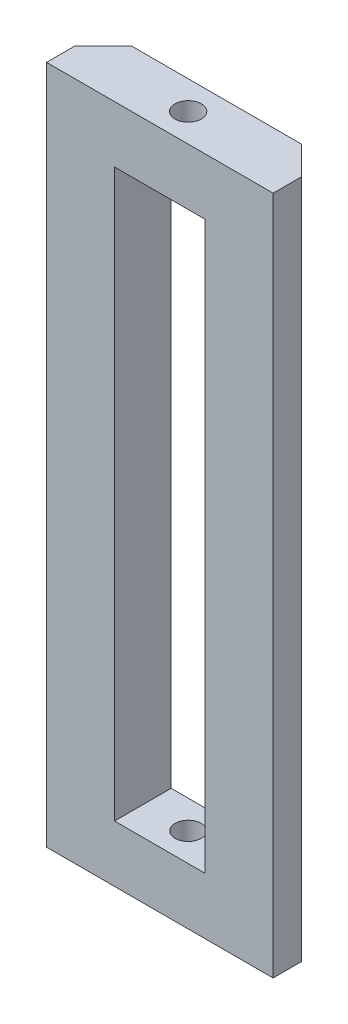
ISO-10303-21;
HEADER;
FILE_DESCRIPTION(('STEP AP214'),'2;1');
FILE_NAME('part.step','',(''),(''),'','','');
FILE_SCHEMA(('AUTOMOTIVE_DESIGN { 1 0 10303 214 1 1 1 1 }'));
ENDSEC;
DATA;
#1=APPLICATION_CONTEXT('core data for automotive mechanical design processes');
#2=APPLICATION_PROTOCOL_DEFINITION('international standard','automotive_design',2000,#1);
#3=PRODUCT_CONTEXT('',#1,'mechanical');
#4=PRODUCT('Part','Part','',(#3));
#5=PRODUCT_RELATED_PRODUCT_CATEGORY('part','',(#4));
#6=PRODUCT_DEFINITION_FORMATION('','',#4);
#7=PRODUCT_DEFINITION_CONTEXT('part definition',#1,'design');
#8=PRODUCT_DEFINITION('design','',#6,#7);
#9=PRODUCT_DEFINITION_SHAPE('','',#8);
#10=(LENGTH_UNIT() NAMED_UNIT(*) SI_UNIT(.MILLI.,.METRE.));
#11=(NAMED_UNIT(*) PLANE_ANGLE_UNIT() SI_UNIT($,.RADIAN.));
#12=(NAMED_UNIT(*) SI_UNIT($,.STERADIAN.) SOLID_ANGLE_UNIT());
#13=UNCERTAINTY_MEASURE_WITH_UNIT(LENGTH_MEASURE(1.E-05),#10,'distance_accuracy_value','');
#14=(GEOMETRIC_REPRESENTATION_CONTEXT(3) GLOBAL_UNCERTAINTY_ASSIGNED_CONTEXT((#13)) GLOBAL_UNIT_ASSIGNED_CONTEXT((#10,
#11,#12)) REPRESENTATION_CONTEXT('',''));
#15=CARTESIAN_POINT('',(0.,0.,0.));
#16=DIRECTION('',(0.,0.,1.));
#17=DIRECTION('',(1.,0.,0.));
#18=AXIS2_PLACEMENT_3D('',#15,#16,#17);
#19=CARTESIAN_POINT('',(-8.33773931879042E-13,126.195974268059,0.));
#20=DIRECTION('',(0.,1.,0.));
#21=DIRECTION('',(-1.,0.,0.));
#22=AXIS2_PLACEMENT_3D('',#19,#20,#21);
#23=PLANE('',#22);
#24=CARTESIAN_POINT('',(64.8089806938939,126.195974268059,43.2731298363772));
#25=DIRECTION('',(0.,1.,0.));
#26=DIRECTION('',(-1.,0.,0.));
#27=AXIS2_PLACEMENT_3D('',#24,#25,#26);
#28=CIRCLE('',#27,2.30000000000002);
#29=CARTESIAN_POINT('',(62.5089806938939,126.195974268059,43.2731298363772));
#30=VERTEX_POINT('',#29);
#31=EDGE_CURVE('E170',#30,#30,#28,.T.);
#32=ORIENTED_EDGE('',*,*,#31,.F.);
#33=EDGE_LOOP('',(#32));
#34=FACE_BOUND('',#33,.T.);
#35=DIRECTION('',(1.,0.,0.));
#36=VECTOR('',#35,1.);
#37=CARTESIAN_POINT('',(44.8089806938939,126.195974268059,48.2731298363772));
#38=LINE('',#37,#36);
#39=CARTESIAN_POINT('',(56.8089806938939,126.195974268059,48.2731298363772));
#40=VERTEX_POINT('',#39);
#41=CARTESIAN_POINT('',(72.808980693894,126.195974268059,48.2731298363772));
#42=VERTEX_POINT('',#41);
#43=EDGE_CURVE('E175',#40,#42,#38,.T.);
#44=ORIENTED_EDGE('',*,*,#43,.T.);
#45=DIRECTION('',(0.,0.,1.));
#46=VECTOR('',#45,1.);
#47=CARTESIAN_POINT('',(72.808980693894,126.195974268059,38.2731298363773));
#48=LINE('',#47,#46);
#49=CARTESIAN_POINT('',(72.808980693894,126.195974268059,38.2731298363773));
#50=VERTEX_POINT('',#49);
#51=EDGE_CURVE('E135',#50,#42,#48,.T.);
#52=ORIENTED_EDGE('',*,*,#51,.F.);
#53=DIRECTION('',(-1.,0.,0.));
#54=VECTOR('',#53,1.);
#55=CARTESIAN_POINT('',(84.808980693894,126.19597426806,38.2731298363773));
#56=LINE('',#55,#54);
#57=CARTESIAN_POINT('',(56.8089806938939,126.195974268059,38.2731298363773));
#58=VERTEX_POINT('',#57);
#59=EDGE_CURVE('E177',#50,#58,#56,.T.);
#60=ORIENTED_EDGE('',*,*,#59,.T.);
#61=DIRECTION('',(0.,0.,-1.));
#62=VECTOR('',#61,1.);
#63=CARTESIAN_POINT('',(56.8089806938939,126.195974268059,38.2731298363773));
#64=LINE('',#63,#62);
#65=EDGE_CURVE('E157',#40,#58,#64,.T.);
#66=ORIENTED_EDGE('',*,*,#65,.F.);
#67=EDGE_LOOP('',(#44,#52,#60,#66));
#68=FACE_BOUND('',#67,.T.);
#69=ADVANCED_FACE('F33',(#34,#68),#23,.T.);
#70=CARTESIAN_POINT('',(-7.65957960631835E-13,116.195974268059,0.));
#71=DIRECTION('',(0.,1.,0.));
#72=DIRECTION('',(-1.,0.,0.));
#73=AXIS2_PLACEMENT_3D('',#70,#71,#72);
#74=PLANE('',#73);
#75=DIRECTION('',(-1.,0.,0.));
#76=VECTOR('',#75,1.);
#77=CARTESIAN_POINT('',(84.808980693894,116.19597426806,38.2731298363773));
#78=LINE('',#77,#76);
#79=CARTESIAN_POINT('',(79.808980693894,116.19597426806,38.2731298363773));
#80=VERTEX_POINT('',#79);
#81=CARTESIAN_POINT('',(49.808980693894,116.195974268059,38.2731298363773));
#82=VERTEX_POINT('',#81);
#83=EDGE_CURVE('E178',#80,#82,#78,.T.);
#84=ORIENTED_EDGE('',*,*,#83,.F.);
#85=DIRECTION('',(-0.707106781186548,0.,-0.707106781186548));
#86=VECTOR('',#85,1.);
#87=CARTESIAN_POINT('',(79.808980693894,116.19597426806,38.2731298363773));
#88=LINE('',#87,#86);
#89=CARTESIAN_POINT('',(84.808980693894,116.19597426806,43.2731298363773));
#90=VERTEX_POINT('',#89);
#91=EDGE_CURVE('E194',#80,#90,#88,.F.);
#92=ORIENTED_EDGE('',*,*,#91,.T.);
#93=DIRECTION('',(0.,0.,-1.));
#94=VECTOR('',#93,1.);
#95=CARTESIAN_POINT('',(84.808980693894,116.19597426806,48.2731298363773));
#96=LINE('',#95,#94);
#97=CARTESIAN_POINT('',(84.808980693894,116.19597426806,48.2731298363773));
#98=VERTEX_POINT('',#97);
#99=EDGE_CURVE('E183',#98,#90,#96,.T.);
#100=ORIENTED_EDGE('',*,*,#99,.F.);
#101=DIRECTION('',(1.,0.,0.));
#102=VECTOR('',#101,1.);
#103=CARTESIAN_POINT('',(44.808980693894,116.195974268059,48.2731298363772));
#104=LINE('',#103,#102);
#105=CARTESIAN_POINT('',(44.808980693894,116.195974268059,48.2731298363772));
#106=VERTEX_POINT('',#105);
#107=EDGE_CURVE('E181',#106,#98,#104,.T.);
#108=ORIENTED_EDGE('',*,*,#107,.F.);
#109=DIRECTION('',(0.,0.,1.));
#110=VECTOR('',#109,1.);
#111=CARTESIAN_POINT('',(44.808980693894,116.195974268059,38.2731298363773));
#112=LINE('',#111,#110);
#113=CARTESIAN_POINT('',(44.808980693894,116.195974268059,43.2731298363772));
#114=VERTEX_POINT('',#113);
#115=EDGE_CURVE('E125',#114,#106,#112,.T.);
#116=ORIENTED_EDGE('',*,*,#115,.F.);
#117=DIRECTION('',(-0.707106781186548,0.,0.707106781186547));
#118=VECTOR('',#117,1.);
#119=CARTESIAN_POINT('',(44.808980693894,116.195974268059,43.2731298363772));
#120=LINE('',#119,#118);
#121=EDGE_CURVE('E192',#114,#82,#120,.F.);
#122=ORIENTED_EDGE('',*,*,#121,.T.);
#123=EDGE_LOOP('',(#84,#92,#100,#108,#116,#122));
#124=FACE_BOUND('',#123,.T.);
#125=CARTESIAN_POINT('',(64.808980693894,116.195974268059,43.2731298363772));
#126=DIRECTION('',(0.,1.,0.));
#127=DIRECTION('',(-1.,0.,0.));
#128=AXIS2_PLACEMENT_3D('',#125,#126,#127);
#129=CIRCLE('',#128,2.30000000000002);
#130=CARTESIAN_POINT('',(62.508980693894,116.195974268059,43.2731298363772));
#131=VERTEX_POINT('',#130);
#132=EDGE_CURVE('E169',#131,#131,#129,.T.);
#133=ORIENTED_EDGE('',*,*,#132,.T.);
#134=EDGE_LOOP('',(#133));
#135=FACE_BOUND('',#134,.T.);
#136=ADVANCED_FACE('F209',(#124,#135),#74,.F.);
#137=CARTESIAN_POINT('',(44.8089806938939,126.195974268059,38.2731298363773));
#138=DIRECTION('',(1.,0.,0.));
#139=DIRECTION('',(0.,1.,0.));
#140=AXIS2_PLACEMENT_3D('',#137,#138,#139);
#141=PLANE('',#140);
#142=DIRECTION('',(0.,0.,1.));
#143=VECTOR('',#142,1.);
#144=CARTESIAN_POINT('',(44.8089806938932,236.195974268059,38.2731298363773));
#145=LINE('',#144,#143);
#146=CARTESIAN_POINT('',(44.8089806938932,236.195974268059,43.2731298363772));
#147=VERTEX_POINT('',#146);
#148=CARTESIAN_POINT('',(44.8089806938932,236.195974268059,48.2731298363772));
#149=VERTEX_POINT('',#148);
#150=EDGE_CURVE('E111',#147,#149,#145,.T.);
#151=ORIENTED_EDGE('',*,*,#150,.F.);
#152=DIRECTION('',(0.,-1.,0.));
#153=VECTOR('',#152,1.);
#154=CARTESIAN_POINT('',(44.8089806938939,126.195974268059,43.2731298363772));
#155=LINE('',#154,#153);
#156=EDGE_CURVE('E11',#147,#114,#155,.T.);
#157=ORIENTED_EDGE('',*,*,#156,.T.);
#158=ORIENTED_EDGE('',*,*,#115,.T.);
#159=DIRECTION('',(0.,-1.,0.));
#160=VECTOR('',#159,1.);
#161=CARTESIAN_POINT('',(44.8089806938939,126.195974268059,48.2731298363772));
#162=LINE('',#161,#160);
#163=EDGE_CURVE('E122',#149,#106,#162,.T.);
#164=ORIENTED_EDGE('',*,*,#163,.F.);
#165=EDGE_LOOP('',(#151,#157,#158,#164));
#166=FACE_BOUND('',#165,.T.);
#167=ADVANCED_FACE('F123',(#166),#141,.F.);
#168=CARTESIAN_POINT('',(44.8089806938939,126.195974268059,48.2731298363772));
#169=DIRECTION('',(0.,0.,-1.));
#170=DIRECTION('',(-1.,0.,0.));
#171=AXIS2_PLACEMENT_3D('',#168,#169,#170);
#172=PLANE('',#171);
#173=DIRECTION('',(0.,-1.,0.));
#174=VECTOR('',#173,1.);
#175=CARTESIAN_POINT('',(56.8089806938933,226.195974268059,48.2731298363772));
#176=LINE('',#175,#174);
#177=CARTESIAN_POINT('',(56.8089806938933,226.195974268059,48.2731298363772));
#178=VERTEX_POINT('',#177);
#179=EDGE_CURVE('E166',#178,#40,#176,.T.);
#180=ORIENTED_EDGE('',*,*,#179,.F.);
#181=DIRECTION('',(1.,0.,0.));
#182=VECTOR('',#181,1.);
#183=CARTESIAN_POINT('',(44.8089806938933,226.195974268059,48.2731298363772));
#184=LINE('',#183,#182);
#185=CARTESIAN_POINT('',(72.8089806938933,226.195974268059,48.2731298363772));
#186=VERTEX_POINT('',#185);
#187=EDGE_CURVE('E142',#178,#186,#184,.T.);
#188=ORIENTED_EDGE('',*,*,#187,.T.);
#189=DIRECTION('',(0.,-1.,0.));
#190=VECTOR('',#189,1.);
#191=CARTESIAN_POINT('',(72.8089806938933,226.195974268059,48.2731298363772));
#192=LINE('',#191,#190);
#193=EDGE_CURVE('E149',#186,#42,#192,.T.);
#194=ORIENTED_EDGE('',*,*,#193,.T.);
#195=ORIENTED_EDGE('',*,*,#43,.F.);
#196=EDGE_LOOP('',(#180,#188,#194,#195));
#197=FACE_BOUND('',#196,.T.);
#198=ORIENTED_EDGE('',*,*,#107,.T.);
#199=DIRECTION('',(0.,-1.,0.));
#200=VECTOR('',#199,1.);
#201=CARTESIAN_POINT('',(84.808980693894,126.19597426806,48.2731298363773));
#202=LINE('',#201,#200);
#203=CARTESIAN_POINT('',(84.8089806938933,236.19597426806,48.2731298363773));
#204=VERTEX_POINT('',#203);
#205=EDGE_CURVE('E129',#204,#98,#202,.T.);
#206=ORIENTED_EDGE('',*,*,#205,.F.);
#207=DIRECTION('',(1.,0.,0.));
#208=VECTOR('',#207,1.);
#209=CARTESIAN_POINT('',(44.8089806938932,236.195974268059,48.2731298363772));
#210=LINE('',#209,#208);
#211=EDGE_CURVE('E116',#149,#204,#210,.T.);
#212=ORIENTED_EDGE('',*,*,#211,.F.);
#213=ORIENTED_EDGE('',*,*,#163,.T.);
#214=EDGE_LOOP('',(#198,#206,#212,#213));
#215=FACE_BOUND('',#214,.T.);
#216=ADVANCED_FACE('F131',(#197,#215),#172,.F.);
#217=CARTESIAN_POINT('',(84.808980693894,126.19597426806,48.2731298363773));
#218=DIRECTION('',(-1.,0.,0.));
#219=DIRECTION('',(0.,-1.,0.));
#220=AXIS2_PLACEMENT_3D('',#217,#218,#219);
#221=PLANE('',#220);
#222=ORIENTED_EDGE('',*,*,#99,.T.);
#223=DIRECTION('',(0.,1.,0.));
#224=VECTOR('',#223,1.);
#225=CARTESIAN_POINT('',(84.808980693894,126.19597426806,43.2731298363773));
#226=LINE('',#225,#224);
#227=CARTESIAN_POINT('',(84.8089806938933,236.19597426806,43.2731298363773));
#228=VERTEX_POINT('',#227);
#229=EDGE_CURVE('E56',#90,#228,#226,.T.);
#230=ORIENTED_EDGE('',*,*,#229,.T.);
#231=DIRECTION('',(0.,0.,-1.));
#232=VECTOR('',#231,1.);
#233=CARTESIAN_POINT('',(84.8089806938933,236.19597426806,48.2731298363773));
#234=LINE('',#233,#232);
#235=EDGE_CURVE('E133',#204,#228,#234,.T.);
#236=ORIENTED_EDGE('',*,*,#235,.F.);
#237=ORIENTED_EDGE('',*,*,#205,.T.);
#238=EDGE_LOOP('',(#222,#230,#236,#237));
#239=FACE_BOUND('',#238,.T.);
#240=ADVANCED_FACE('F211',(#239),#221,.F.);
#241=CARTESIAN_POINT('',(84.808980693894,126.19597426806,38.2731298363773));
#242=DIRECTION('',(0.,0.,1.));
#243=DIRECTION('',(1.,0.,0.));
#244=AXIS2_PLACEMENT_3D('',#241,#242,#243);
#245=PLANE('',#244);
#246=DIRECTION('',(-1.,0.,0.));
#247=VECTOR('',#246,1.);
#248=CARTESIAN_POINT('',(84.8089806938933,236.19597426806,38.2731298363773));
#249=LINE('',#248,#247);
#250=CARTESIAN_POINT('',(79.8089806938932,236.19597426806,38.2731298363773));
#251=VERTEX_POINT('',#250);
#252=CARTESIAN_POINT('',(49.8089806938932,236.195974268059,38.2731298363773));
#253=VERTEX_POINT('',#252);
#254=EDGE_CURVE('E119',#251,#253,#249,.T.);
#255=ORIENTED_EDGE('',*,*,#254,.F.);
#256=DIRECTION('',(0.,-1.,0.));
#257=VECTOR('',#256,1.);
#258=CARTESIAN_POINT('',(79.808980693894,126.19597426806,38.2731298363773));
#259=LINE('',#258,#257);
#260=EDGE_CURVE('E189',#251,#80,#259,.T.);
#261=ORIENTED_EDGE('',*,*,#260,.T.);
#262=ORIENTED_EDGE('',*,*,#83,.T.);
#263=DIRECTION('',(0.,1.,0.));
#264=VECTOR('',#263,1.);
#265=CARTESIAN_POINT('',(49.8089806938939,126.195974268059,38.2731298363773));
#266=LINE('',#265,#264);
#267=EDGE_CURVE('E128',#82,#253,#266,.T.);
#268=ORIENTED_EDGE('',*,*,#267,.T.);
#269=EDGE_LOOP('',(#255,#261,#262,#268));
#270=FACE_BOUND('',#269,.T.);
#271=DIRECTION('',(-1.,0.,0.));
#272=VECTOR('',#271,1.);
#273=CARTESIAN_POINT('',(84.8089806938933,226.19597426806,38.2731298363773));
#274=LINE('',#273,#272);
#275=CARTESIAN_POINT('',(72.8089806938933,226.195974268059,38.2731298363773));
#276=VERTEX_POINT('',#275);
#277=CARTESIAN_POINT('',(56.8089806938933,226.195974268059,38.2731298363773));
#278=VERTEX_POINT('',#277);
#279=EDGE_CURVE('E139',#276,#278,#274,.T.);
#280=ORIENTED_EDGE('',*,*,#279,.T.);
#281=DIRECTION('',(0.,-1.,0.));
#282=VECTOR('',#281,1.);
#283=CARTESIAN_POINT('',(56.8089806938933,226.195974268059,38.2731298363773));
#284=LINE('',#283,#282);
#285=EDGE_CURVE('E161',#278,#58,#284,.T.);
#286=ORIENTED_EDGE('',*,*,#285,.T.);
#287=ORIENTED_EDGE('',*,*,#59,.F.);
#288=DIRECTION('',(0.,-1.,0.));
#289=VECTOR('',#288,1.);
#290=CARTESIAN_POINT('',(72.8089806938933,226.195974268059,38.2731298363773));
#291=LINE('',#290,#289);
#292=EDGE_CURVE('E154',#276,#50,#291,.T.);
#293=ORIENTED_EDGE('',*,*,#292,.F.);
#294=EDGE_LOOP('',(#280,#286,#287,#293));
#295=FACE_BOUND('',#294,.T.);
#296=ADVANCED_FACE('F202',(#270,#295),#245,.F.);
#297=CARTESIAN_POINT('',(64.8089806938939,126.195974268059,43.2731298363772));
#298=DIRECTION('',(0.,-1.,0.));
#299=DIRECTION('',(1.,0.,0.));
#300=AXIS2_PLACEMENT_3D('',#297,#298,#299);
#301=CYLINDRICAL_SURFACE('',#300,2.30000000000002);
#302=ORIENTED_EDGE('',*,*,#31,.T.);
#303=EDGE_LOOP('',(#302));
#304=FACE_BOUND('',#303,.T.);
#305=ORIENTED_EDGE('',*,*,#132,.F.);
#306=EDGE_LOOP('',(#305));
#307=FACE_BOUND('',#306,.T.);
#308=ADVANCED_FACE('F218',(#304,#307),#301,.F.);
#309=CARTESIAN_POINT('',(56.8089806938933,226.195974268059,38.2731298363773));
#310=DIRECTION('',(-1.,0.,0.));
#311=DIRECTION('',(0.,-1.,0.));
#312=AXIS2_PLACEMENT_3D('',#309,#310,#311);
#313=PLANE('',#312);
#314=ORIENTED_EDGE('',*,*,#65,.T.);
#315=ORIENTED_EDGE('',*,*,#285,.F.);
#316=DIRECTION('',(0.,0.,-1.));
#317=VECTOR('',#316,1.);
#318=CARTESIAN_POINT('',(56.8089806938933,226.195974268059,38.2731298363773));
#319=LINE('',#318,#317);
#320=EDGE_CURVE('E158',#178,#278,#319,.T.);
#321=ORIENTED_EDGE('',*,*,#320,.F.);
#322=ORIENTED_EDGE('',*,*,#179,.T.);
#323=EDGE_LOOP('',(#314,#315,#321,#322));
#324=FACE_BOUND('',#323,.T.);
#325=ADVANCED_FACE('F234',(#324),#313,.F.);
#326=CARTESIAN_POINT('',(72.8089806938933,226.195974268059,38.2731298363773));
#327=DIRECTION('',(1.,0.,0.));
#328=DIRECTION('',(0.,1.,0.));
#329=AXIS2_PLACEMENT_3D('',#326,#327,#328);
#330=PLANE('',#329);
#331=ORIENTED_EDGE('',*,*,#51,.T.);
#332=ORIENTED_EDGE('',*,*,#193,.F.);
#333=DIRECTION('',(0.,0.,1.));
#334=VECTOR('',#333,1.);
#335=CARTESIAN_POINT('',(72.8089806938933,226.195974268059,38.2731298363773));
#336=LINE('',#335,#334);
#337=EDGE_CURVE('E146',#276,#186,#336,.T.);
#338=ORIENTED_EDGE('',*,*,#337,.F.);
#339=ORIENTED_EDGE('',*,*,#292,.T.);
#340=EDGE_LOOP('',(#331,#332,#338,#339));
#341=FACE_BOUND('',#340,.T.);
#342=ADVANCED_FACE('F238',(#341),#330,.F.);
#343=CARTESIAN_POINT('',(-1.56954986693699E-12,226.195974268059,0.));
#344=DIRECTION('',(0.,1.,0.));
#345=DIRECTION('',(-1.,0.,0.));
#346=AXIS2_PLACEMENT_3D('',#343,#344,#345);
#347=PLANE('',#346);
#348=CARTESIAN_POINT('',(64.8089806938932,226.195974268059,43.2731298363772));
#349=DIRECTION('',(0.,1.,0.));
#350=DIRECTION('',(-1.,0.,0.));
#351=AXIS2_PLACEMENT_3D('',#348,#349,#350);
#352=CIRCLE('',#351,2.32929018177819);
#353=CARTESIAN_POINT('',(62.4796905121151,226.195974268059,43.2731298363772));
#354=VERTEX_POINT('',#353);
#355=EDGE_CURVE('E260',#354,#354,#352,.T.);
#356=ORIENTED_EDGE('',*,*,#355,.T.);
#357=EDGE_LOOP('',(#356));
#358=FACE_BOUND('',#357,.T.);
#359=ORIENTED_EDGE('',*,*,#187,.F.);
#360=ORIENTED_EDGE('',*,*,#320,.T.);
#361=ORIENTED_EDGE('',*,*,#279,.F.);
#362=ORIENTED_EDGE('',*,*,#337,.T.);
#363=EDGE_LOOP('',(#359,#360,#361,#362));
#364=FACE_BOUND('',#363,.T.);
#365=ADVANCED_FACE('F242',(#358,#364),#347,.F.);
#366=CARTESIAN_POINT('',(-1.63893880597606E-12,236.195974268059,0.));
#367=DIRECTION('',(0.,1.,0.));
#368=DIRECTION('',(-1.,0.,0.));
#369=AXIS2_PLACEMENT_3D('',#366,#367,#368);
#370=PLANE('',#369);
#371=ORIENTED_EDGE('',*,*,#235,.T.);
#372=DIRECTION('',(0.707106781186548,0.,0.707106781186548));
#373=VECTOR('',#372,1.);
#374=CARTESIAN_POINT('',(20.7679254287572,236.195974268059,-20.7679254287588));
#375=LINE('',#374,#373);
#376=EDGE_CURVE('E41',#228,#251,#375,.F.);
#377=ORIENTED_EDGE('',*,*,#376,.T.);
#378=ORIENTED_EDGE('',*,*,#254,.T.);
#379=DIRECTION('',(0.707106781186548,0.,-0.707106781186547));
#380=VECTOR('',#379,1.);
#381=CARTESIAN_POINT('',(44.0410552651343,236.195974268059,44.0410552651361));
#382=LINE('',#381,#380);
#383=EDGE_CURVE('E48',#253,#147,#382,.F.);
#384=ORIENTED_EDGE('',*,*,#383,.T.);
#385=ORIENTED_EDGE('',*,*,#150,.T.);
#386=ORIENTED_EDGE('',*,*,#211,.T.);
#387=EDGE_LOOP('',(#371,#377,#378,#384,#385,#386));
#388=FACE_BOUND('',#387,.T.);
#389=CARTESIAN_POINT('',(64.8089806938932,236.195974268059,43.2731298363772));
#390=DIRECTION('',(0.,1.,0.));
#391=DIRECTION('',(-1.,0.,0.));
#392=AXIS2_PLACEMENT_3D('',#389,#390,#391);
#393=CIRCLE('',#392,2.32929018177819);
#394=CARTESIAN_POINT('',(62.479690512115,236.195974268059,43.2731298363772));
#395=VERTEX_POINT('',#394);
#396=EDGE_CURVE('E143',#395,#395,#393,.T.);
#397=ORIENTED_EDGE('',*,*,#396,.F.);
#398=EDGE_LOOP('',(#397));
#399=FACE_BOUND('',#398,.T.);
#400=ADVANCED_FACE('F113',(#388,#399),#370,.T.);
#401=CARTESIAN_POINT('',(64.8089806938932,236.195974268059,43.2731298363772));
#402=DIRECTION('',(0.,-1.,0.));
#403=DIRECTION('',(1.,0.,0.));
#404=AXIS2_PLACEMENT_3D('',#401,#402,#403);
#405=CYLINDRICAL_SURFACE('',#404,2.32929018177819);
#406=ORIENTED_EDGE('',*,*,#396,.T.);
#407=EDGE_LOOP('',(#406));
#408=FACE_BOUND('',#407,.T.);
#409=ORIENTED_EDGE('',*,*,#355,.F.);
#410=EDGE_LOOP('',(#409));
#411=FACE_BOUND('',#410,.T.);
#412=ADVANCED_FACE('F249',(#408,#411),#405,.F.);
#413=CARTESIAN_POINT('',(79.808980693894,126.19597426806,38.2731298363773));
#414=DIRECTION('',(-0.707106781186547,0.,0.707106781186547));
#415=DIRECTION('',(0.,-1.,0.));
#416=AXIS2_PLACEMENT_3D('',#413,#414,#415);
#417=PLANE('',#416);
#418=ORIENTED_EDGE('',*,*,#376,.F.);
#419=ORIENTED_EDGE('',*,*,#229,.F.);
#420=ORIENTED_EDGE('',*,*,#91,.F.);
#421=ORIENTED_EDGE('',*,*,#260,.F.);
#422=EDGE_LOOP('',(#418,#419,#420,#421));
#423=FACE_BOUND('',#422,.T.);
#424=ADVANCED_FACE('F206',(#423),#417,.F.);
#425=CARTESIAN_POINT('',(44.8089806938939,126.195974268059,43.2731298363772));
#426=DIRECTION('',(0.707106781186547,0.,0.707106781186548));
#427=DIRECTION('',(0.,-1.,0.));
#428=AXIS2_PLACEMENT_3D('',#425,#426,#427);
#429=PLANE('',#428);
#430=ORIENTED_EDGE('',*,*,#383,.F.);
#431=ORIENTED_EDGE('',*,*,#267,.F.);
#432=ORIENTED_EDGE('',*,*,#121,.F.);
#433=ORIENTED_EDGE('',*,*,#156,.F.);
#434=EDGE_LOOP('',(#430,#431,#432,#433));
#435=FACE_BOUND('',#434,.T.);
#436=ADVANCED_FACE('F35',(#435),#429,.F.);
#437=CLOSED_SHELL('',(#69,#136,#167,#216,#240,#296,#308,#325,#342,#365,#400,#412,#424,#436));
#438=MANIFOLD_SOLID_BREP('B2',#437);
#439=ADVANCED_BREP_SHAPE_REPRESENTATION('',(#18,#438),#14);
#440=SHAPE_DEFINITION_REPRESENTATION(#9,#439);
ENDSEC;
END-ISO-10303-21;
